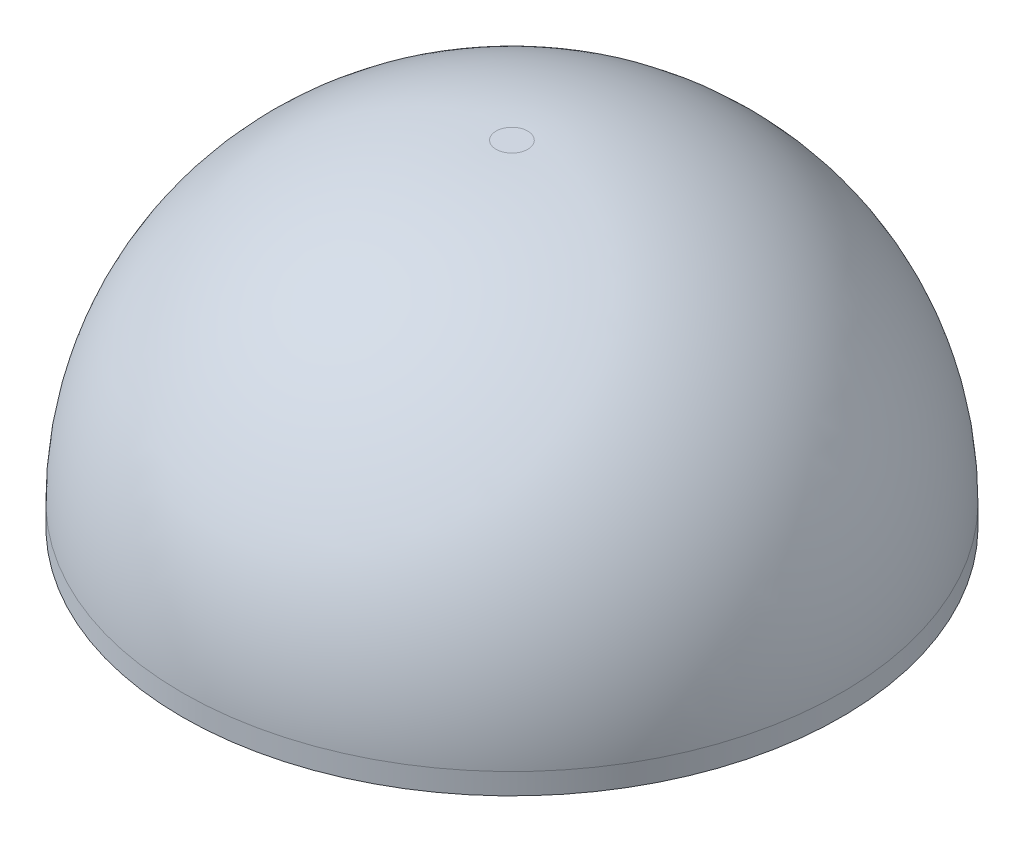
ISO-10303-21;
HEADER;
FILE_DESCRIPTION(('STEP AP214'),'2;1');
FILE_NAME('part.step','',(''),(''),'','','');
FILE_SCHEMA(('AUTOMOTIVE_DESIGN { 1 0 10303 214 1 1 1 1 }'));
ENDSEC;
DATA;
#1=APPLICATION_CONTEXT('core data for automotive mechanical design processes');
#2=APPLICATION_PROTOCOL_DEFINITION('international standard','automotive_design',2000,#1);
#3=PRODUCT_CONTEXT('',#1,'mechanical');
#4=PRODUCT('Part','Part','',(#3));
#5=PRODUCT_RELATED_PRODUCT_CATEGORY('part','',(#4));
#6=PRODUCT_DEFINITION_FORMATION('','',#4);
#7=PRODUCT_DEFINITION_CONTEXT('part definition',#1,'design');
#8=PRODUCT_DEFINITION('design','',#6,#7);
#9=PRODUCT_DEFINITION_SHAPE('','',#8);
#10=(LENGTH_UNIT() NAMED_UNIT(*) SI_UNIT(.MILLI.,.METRE.));
#11=(NAMED_UNIT(*) PLANE_ANGLE_UNIT() SI_UNIT($,.RADIAN.));
#12=(NAMED_UNIT(*) SI_UNIT($,.STERADIAN.) SOLID_ANGLE_UNIT());
#13=UNCERTAINTY_MEASURE_WITH_UNIT(LENGTH_MEASURE(1.E-05),#10,'distance_accuracy_value','');
#14=(GEOMETRIC_REPRESENTATION_CONTEXT(3) GLOBAL_UNCERTAINTY_ASSIGNED_CONTEXT((#13)) GLOBAL_UNIT_ASSIGNED_CONTEXT((#10,
#11,#12)) REPRESENTATION_CONTEXT('',''));
#15=CARTESIAN_POINT('',(0.,0.,0.));
#16=DIRECTION('',(0.,0.,1.));
#17=DIRECTION('',(1.,0.,0.));
#18=AXIS2_PLACEMENT_3D('',#15,#16,#17);
#19=CARTESIAN_POINT('',(0.,2.54,0.));
#20=DIRECTION('',(0.,-1.,0.));
#21=DIRECTION('',(0.,0.,-1.));
#22=AXIS2_PLACEMENT_3D('',#19,#20,#21);
#23=CYLINDRICAL_SURFACE('',#22,2.5);
#24=CARTESIAN_POINT('',(0.,0.160000000000006,0.));
#25=DIRECTION('',(0.,1.,0.));
#26=DIRECTION('',(0.,0.,1.));
#27=AXIS2_PLACEMENT_3D('',#24,#25,#26);
#28=CIRCLE('',#27,2.5);
#29=CARTESIAN_POINT('',(0.,0.160000000000006,2.5));
#30=VERTEX_POINT('',#29);
#31=EDGE_CURVE('E10',#30,#30,#28,.F.);
#32=ORIENTED_EDGE('',*,*,#31,.T.);
#33=EDGE_LOOP('',(#32));
#34=FACE_BOUND('',#33,.T.);
#35=CARTESIAN_POINT('',(0.,0.,0.));
#36=DIRECTION('',(0.,1.,0.));
#37=DIRECTION('',(0.,0.,1.));
#38=AXIS2_PLACEMENT_3D('',#35,#36,#37);
#39=CIRCLE('',#38,2.5);
#40=CARTESIAN_POINT('',(0.,0.,2.5));
#41=VERTEX_POINT('',#40);
#42=EDGE_CURVE('E50',#41,#41,#39,.T.);
#43=ORIENTED_EDGE('',*,*,#42,.T.);
#44=EDGE_LOOP('',(#43));
#45=FACE_BOUND('',#44,.T.);
#46=ADVANCED_FACE('F37',(#34,#45),#23,.T.);
#47=CARTESIAN_POINT('',(0.,2.54,0.));
#48=DIRECTION('',(0.,1.,0.));
#49=DIRECTION('',(0.,0.,1.));
#50=AXIS2_PLACEMENT_3D('',#47,#48,#49);
#51=PLANE('',#50);
#52=CARTESIAN_POINT('',(0.,2.54,0.));
#53=DIRECTION('',(0.,1.,0.));
#54=DIRECTION('',(0.,0.,1.));
#55=AXIS2_PLACEMENT_3D('',#52,#53,#54);
#56=CIRCLE('',#55,0.120000000000006);
#57=CARTESIAN_POINT('',(0.,2.54,0.120000000000006));
#58=VERTEX_POINT('',#57);
#59=EDGE_CURVE('E45',#58,#58,#56,.T.);
#60=ORIENTED_EDGE('',*,*,#59,.T.);
#61=EDGE_LOOP('',(#60));
#62=FACE_BOUND('',#61,.T.);
#63=ADVANCED_FACE('F61',(#62),#51,.T.);
#64=CARTESIAN_POINT('',(0.,0.,0.));
#65=DIRECTION('',(0.,1.,0.));
#66=DIRECTION('',(0.,0.,1.));
#67=AXIS2_PLACEMENT_3D('',#64,#65,#66);
#68=PLANE('',#67);
#69=ORIENTED_EDGE('',*,*,#42,.F.);
#70=EDGE_LOOP('',(#69));
#71=FACE_BOUND('',#70,.T.);
#72=ADVANCED_FACE('F59',(#71),#68,.F.);
#73=CARTESIAN_POINT('',(0.,0.160000000000006,0.));
#74=DIRECTION('',(0.,1.,0.));
#75=DIRECTION('',(0.,0.,1.));
#76=AXIS2_PLACEMENT_3D('',#73,#74,#75);
#77=DEGENERATE_TOROIDAL_SURFACE('',#76,0.120000000000006,2.37999999999999,.T.);
#78=ORIENTED_EDGE('',*,*,#31,.F.);
#79=EDGE_LOOP('',(#78));
#80=FACE_BOUND('',#79,.T.);
#81=ORIENTED_EDGE('',*,*,#59,.F.);
#82=EDGE_LOOP('',(#81));
#83=FACE_BOUND('',#82,.T.);
#84=ADVANCED_FACE('F39',(#80,#83),#77,.T.);
#85=CLOSED_SHELL('',(#46,#63,#72,#84));
#86=MANIFOLD_SOLID_BREP('B2',#85);
#87=ADVANCED_BREP_SHAPE_REPRESENTATION('',(#18,#86),#14);
#88=SHAPE_DEFINITION_REPRESENTATION(#9,#87);
ENDSEC;
END-ISO-10303-21;
